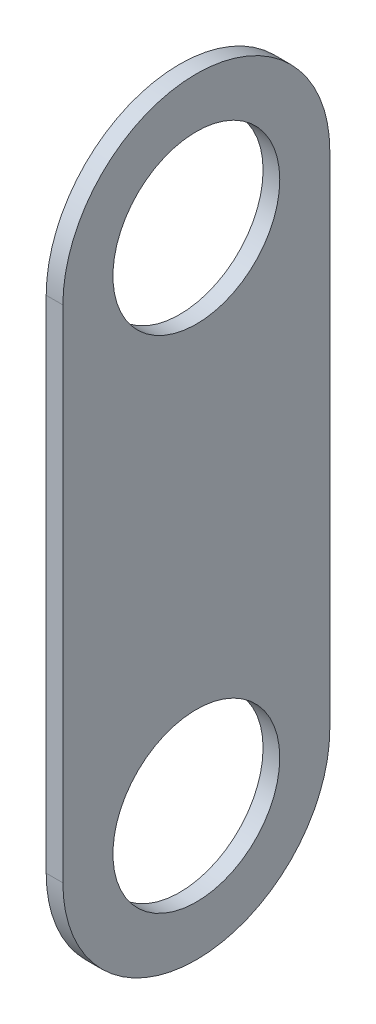
ISO-10303-21;
HEADER;
FILE_DESCRIPTION(('STEP AP214'),'2;1');
FILE_NAME('part.step','',(''),(''),'','','');
FILE_SCHEMA(('AUTOMOTIVE_DESIGN { 1 0 10303 214 1 1 1 1 }'));
ENDSEC;
DATA;
#1=APPLICATION_CONTEXT('core data for automotive mechanical design processes');
#2=APPLICATION_PROTOCOL_DEFINITION('international standard','automotive_design',2000,#1);
#3=PRODUCT_CONTEXT('',#1,'mechanical');
#4=PRODUCT('Part','Part','',(#3));
#5=PRODUCT_RELATED_PRODUCT_CATEGORY('part','',(#4));
#6=PRODUCT_DEFINITION_FORMATION('','',#4);
#7=PRODUCT_DEFINITION_CONTEXT('part definition',#1,'design');
#8=PRODUCT_DEFINITION('design','',#6,#7);
#9=PRODUCT_DEFINITION_SHAPE('','',#8);
#10=(LENGTH_UNIT() NAMED_UNIT(*) SI_UNIT(.MILLI.,.METRE.));
#11=(NAMED_UNIT(*) PLANE_ANGLE_UNIT() SI_UNIT($,.RADIAN.));
#12=(NAMED_UNIT(*) SI_UNIT($,.STERADIAN.) SOLID_ANGLE_UNIT());
#13=UNCERTAINTY_MEASURE_WITH_UNIT(LENGTH_MEASURE(1.E-05),#10,'distance_accuracy_value','');
#14=(GEOMETRIC_REPRESENTATION_CONTEXT(3) GLOBAL_UNCERTAINTY_ASSIGNED_CONTEXT((#13)) GLOBAL_UNIT_ASSIGNED_CONTEXT((#10,
#11,#12)) REPRESENTATION_CONTEXT('',''));
#15=CARTESIAN_POINT('',(0.,0.,0.));
#16=DIRECTION('',(0.,0.,1.));
#17=DIRECTION('',(1.,0.,0.));
#18=AXIS2_PLACEMENT_3D('',#15,#16,#17);
#19=CARTESIAN_POINT('',(-0.5,-7.5,0.));
#20=DIRECTION('',(1.,0.,0.));
#21=DIRECTION('',(0.,0.,-1.));
#22=AXIS2_PLACEMENT_3D('',#19,#20,#21);
#23=CYLINDRICAL_SURFACE('',#22,4.);
#24=CARTESIAN_POINT('',(0.,-7.5,0.));
#25=DIRECTION('',(1.,0.,0.));
#26=DIRECTION('',(0.,0.,-1.));
#27=AXIS2_PLACEMENT_3D('',#24,#25,#26);
#28=CIRCLE('',#27,4.);
#29=CARTESIAN_POINT('',(0.,-7.5,4.));
#30=VERTEX_POINT('',#29);
#31=CARTESIAN_POINT('',(0.,-7.5,-4.));
#32=VERTEX_POINT('',#31);
#33=EDGE_CURVE('E102',#30,#32,#28,.T.);
#34=ORIENTED_EDGE('',*,*,#33,.F.);
#35=DIRECTION('',(1.,0.,0.));
#36=VECTOR('',#35,1.);
#37=CARTESIAN_POINT('',(-0.5,-7.5,4.));
#38=LINE('',#37,#36);
#39=CARTESIAN_POINT('',(-0.5,-7.5,4.));
#40=VERTEX_POINT('',#39);
#41=EDGE_CURVE('E11',#40,#30,#38,.T.);
#42=ORIENTED_EDGE('',*,*,#41,.F.);
#43=CARTESIAN_POINT('',(-0.5,-7.5,0.));
#44=DIRECTION('',(1.,0.,0.));
#45=DIRECTION('',(0.,0.,-1.));
#46=AXIS2_PLACEMENT_3D('',#43,#44,#45);
#47=CIRCLE('',#46,4.);
#48=CARTESIAN_POINT('',(-0.5,-7.5,-4.));
#49=VERTEX_POINT('',#48);
#50=EDGE_CURVE('E95',#40,#49,#47,.T.);
#51=ORIENTED_EDGE('',*,*,#50,.T.);
#52=DIRECTION('',(1.,0.,0.));
#53=VECTOR('',#52,1.);
#54=CARTESIAN_POINT('',(-0.5,-7.5,-4.));
#55=LINE('',#54,#53);
#56=EDGE_CURVE('E40',#49,#32,#55,.T.);
#57=ORIENTED_EDGE('',*,*,#56,.T.);
#58=EDGE_LOOP('',(#34,#42,#51,#57));
#59=FACE_BOUND('',#58,.T.);
#60=ADVANCED_FACE('F37',(#59),#23,.T.);
#61=CARTESIAN_POINT('',(-0.5,-7.5,4.));
#62=DIRECTION('',(0.,0.,1.));
#63=DIRECTION('',(0.,-1.,0.));
#64=AXIS2_PLACEMENT_3D('',#61,#62,#63);
#65=PLANE('',#64);
#66=DIRECTION('',(0.,-1.,0.));
#67=VECTOR('',#66,1.);
#68=CARTESIAN_POINT('',(0.,-7.5,4.));
#69=LINE('',#68,#67);
#70=CARTESIAN_POINT('',(0.,7.5,4.00000000000001));
#71=VERTEX_POINT('',#70);
#72=EDGE_CURVE('E97',#71,#30,#69,.T.);
#73=ORIENTED_EDGE('',*,*,#72,.F.);
#74=DIRECTION('',(1.,0.,0.));
#75=VECTOR('',#74,1.);
#76=CARTESIAN_POINT('',(-0.5,7.5,4.00000000000001));
#77=LINE('',#76,#75);
#78=CARTESIAN_POINT('',(-0.5,7.5,4.00000000000001));
#79=VERTEX_POINT('',#78);
#80=EDGE_CURVE('E46',#79,#71,#77,.T.);
#81=ORIENTED_EDGE('',*,*,#80,.F.);
#82=DIRECTION('',(0.,-1.,0.));
#83=VECTOR('',#82,1.);
#84=CARTESIAN_POINT('',(-0.5,-7.5,4.));
#85=LINE('',#84,#83);
#86=EDGE_CURVE('E92',#79,#40,#85,.T.);
#87=ORIENTED_EDGE('',*,*,#86,.T.);
#88=ORIENTED_EDGE('',*,*,#41,.T.);
#89=EDGE_LOOP('',(#73,#81,#87,#88));
#90=FACE_BOUND('',#89,.T.);
#91=ADVANCED_FACE('F113',(#90),#65,.T.);
#92=CARTESIAN_POINT('',(-0.5,7.5,0.));
#93=DIRECTION('',(1.,0.,0.));
#94=DIRECTION('',(0.,0.,-1.));
#95=AXIS2_PLACEMENT_3D('',#92,#93,#94);
#96=CYLINDRICAL_SURFACE('',#95,4.);
#97=CARTESIAN_POINT('',(0.,7.5,0.));
#98=DIRECTION('',(1.,0.,0.));
#99=DIRECTION('',(0.,0.,-1.));
#100=AXIS2_PLACEMENT_3D('',#97,#98,#99);
#101=CIRCLE('',#100,4.);
#102=CARTESIAN_POINT('',(0.,7.5,-4.));
#103=VERTEX_POINT('',#102);
#104=EDGE_CURVE('E87',#103,#71,#101,.T.);
#105=ORIENTED_EDGE('',*,*,#104,.F.);
#106=DIRECTION('',(1.,0.,0.));
#107=VECTOR('',#106,1.);
#108=CARTESIAN_POINT('',(-0.5,7.5,-4.));
#109=LINE('',#108,#107);
#110=CARTESIAN_POINT('',(-0.5,7.5,-4.));
#111=VERTEX_POINT('',#110);
#112=EDGE_CURVE('E82',#111,#103,#109,.T.);
#113=ORIENTED_EDGE('',*,*,#112,.F.);
#114=CARTESIAN_POINT('',(-0.5,7.5,0.));
#115=DIRECTION('',(1.,0.,0.));
#116=DIRECTION('',(0.,0.,-1.));
#117=AXIS2_PLACEMENT_3D('',#114,#115,#116);
#118=CIRCLE('',#117,4.);
#119=EDGE_CURVE('E85',#111,#79,#118,.T.);
#120=ORIENTED_EDGE('',*,*,#119,.T.);
#121=ORIENTED_EDGE('',*,*,#80,.T.);
#122=EDGE_LOOP('',(#105,#113,#120,#121));
#123=FACE_BOUND('',#122,.T.);
#124=ADVANCED_FACE('F84',(#123),#96,.T.);
#125=CARTESIAN_POINT('',(-0.5,-7.5,-4.));
#126=DIRECTION('',(0.,0.,-1.));
#127=DIRECTION('',(0.,1.,0.));
#128=AXIS2_PLACEMENT_3D('',#125,#126,#127);
#129=PLANE('',#128);
#130=DIRECTION('',(0.,1.,0.));
#131=VECTOR('',#130,1.);
#132=CARTESIAN_POINT('',(0.,-7.5,-4.));
#133=LINE('',#132,#131);
#134=EDGE_CURVE('E105',#32,#103,#133,.T.);
#135=ORIENTED_EDGE('',*,*,#134,.F.);
#136=ORIENTED_EDGE('',*,*,#56,.F.);
#137=DIRECTION('',(0.,1.,0.));
#138=VECTOR('',#137,1.);
#139=CARTESIAN_POINT('',(-0.5,-7.5,-4.));
#140=LINE('',#139,#138);
#141=EDGE_CURVE('E91',#49,#111,#140,.T.);
#142=ORIENTED_EDGE('',*,*,#141,.T.);
#143=ORIENTED_EDGE('',*,*,#112,.T.);
#144=EDGE_LOOP('',(#135,#136,#142,#143));
#145=FACE_BOUND('',#144,.T.);
#146=ADVANCED_FACE('F94',(#145),#129,.T.);
#147=CARTESIAN_POINT('',(-0.5,-7.5,0.));
#148=DIRECTION('',(1.,0.,0.));
#149=DIRECTION('',(0.,0.,-1.));
#150=AXIS2_PLACEMENT_3D('',#147,#148,#149);
#151=PLANE('',#150);
#152=CARTESIAN_POINT('',(-0.5,-7.5,0.));
#153=DIRECTION('',(1.,0.,0.));
#154=DIRECTION('',(0.,0.,-1.));
#155=AXIS2_PLACEMENT_3D('',#152,#153,#154);
#156=CIRCLE('',#155,2.5);
#157=CARTESIAN_POINT('',(-0.5,-7.5,-2.5));
#158=VERTEX_POINT('',#157);
#159=EDGE_CURVE('E146',#158,#158,#156,.T.);
#160=ORIENTED_EDGE('',*,*,#159,.T.);
#161=EDGE_LOOP('',(#160));
#162=FACE_BOUND('',#161,.T.);
#163=CARTESIAN_POINT('',(-0.5,7.5,0.));
#164=DIRECTION('',(1.,0.,0.));
#165=DIRECTION('',(0.,0.,-1.));
#166=AXIS2_PLACEMENT_3D('',#163,#164,#165);
#167=CIRCLE('',#166,2.5);
#168=CARTESIAN_POINT('',(-0.5,7.5,-2.5));
#169=VERTEX_POINT('',#168);
#170=EDGE_CURVE('E106',#169,#169,#167,.T.);
#171=ORIENTED_EDGE('',*,*,#170,.T.);
#172=EDGE_LOOP('',(#171));
#173=FACE_BOUND('',#172,.T.);
#174=ORIENTED_EDGE('',*,*,#50,.F.);
#175=ORIENTED_EDGE('',*,*,#86,.F.);
#176=ORIENTED_EDGE('',*,*,#119,.F.);
#177=ORIENTED_EDGE('',*,*,#141,.F.);
#178=EDGE_LOOP('',(#174,#175,#176,#177));
#179=FACE_BOUND('',#178,.T.);
#180=ADVANCED_FACE('F90',(#162,#173,#179),#151,.F.);
#181=CARTESIAN_POINT('',(0.,-7.5,0.));
#182=DIRECTION('',(1.,0.,0.));
#183=DIRECTION('',(0.,0.,-1.));
#184=AXIS2_PLACEMENT_3D('',#181,#182,#183);
#185=PLANE('',#184);
#186=CARTESIAN_POINT('',(0.,-7.5,0.));
#187=DIRECTION('',(1.,0.,0.));
#188=DIRECTION('',(0.,0.,-1.));
#189=AXIS2_PLACEMENT_3D('',#186,#187,#188);
#190=CIRCLE('',#189,2.5);
#191=CARTESIAN_POINT('',(0.,-7.5,-2.5));
#192=VERTEX_POINT('',#191);
#193=EDGE_CURVE('E149',#192,#192,#190,.T.);
#194=ORIENTED_EDGE('',*,*,#193,.F.);
#195=EDGE_LOOP('',(#194));
#196=FACE_BOUND('',#195,.T.);
#197=CARTESIAN_POINT('',(0.,7.5,0.));
#198=DIRECTION('',(1.,0.,0.));
#199=DIRECTION('',(0.,0.,-1.));
#200=AXIS2_PLACEMENT_3D('',#197,#198,#199);
#201=CIRCLE('',#200,2.5);
#202=CARTESIAN_POINT('',(0.,7.5,-2.5));
#203=VERTEX_POINT('',#202);
#204=EDGE_CURVE('E151',#203,#203,#201,.T.);
#205=ORIENTED_EDGE('',*,*,#204,.F.);
#206=EDGE_LOOP('',(#205));
#207=FACE_BOUND('',#206,.T.);
#208=ORIENTED_EDGE('',*,*,#33,.T.);
#209=ORIENTED_EDGE('',*,*,#134,.T.);
#210=ORIENTED_EDGE('',*,*,#104,.T.);
#211=ORIENTED_EDGE('',*,*,#72,.T.);
#212=EDGE_LOOP('',(#208,#209,#210,#211));
#213=FACE_BOUND('',#212,.T.);
#214=ADVANCED_FACE('F112',(#196,#207,#213),#185,.T.);
#215=CARTESIAN_POINT('',(-0.5,7.5,0.));
#216=DIRECTION('',(1.,0.,0.));
#217=DIRECTION('',(0.,0.,-1.));
#218=AXIS2_PLACEMENT_3D('',#215,#216,#217);
#219=CYLINDRICAL_SURFACE('',#218,2.5);
#220=ORIENTED_EDGE('',*,*,#170,.F.);
#221=EDGE_LOOP('',(#220));
#222=FACE_BOUND('',#221,.T.);
#223=ORIENTED_EDGE('',*,*,#204,.T.);
#224=EDGE_LOOP('',(#223));
#225=FACE_BOUND('',#224,.T.);
#226=ADVANCED_FACE('F131',(#222,#225),#219,.F.);
#227=CARTESIAN_POINT('',(-0.5,-7.5,0.));
#228=DIRECTION('',(1.,0.,0.));
#229=DIRECTION('',(0.,0.,-1.));
#230=AXIS2_PLACEMENT_3D('',#227,#228,#229);
#231=CYLINDRICAL_SURFACE('',#230,2.5);
#232=ORIENTED_EDGE('',*,*,#159,.F.);
#233=EDGE_LOOP('',(#232));
#234=FACE_BOUND('',#233,.T.);
#235=ORIENTED_EDGE('',*,*,#193,.T.);
#236=EDGE_LOOP('',(#235));
#237=FACE_BOUND('',#236,.T.);
#238=ADVANCED_FACE('F138',(#234,#237),#231,.F.);
#239=CLOSED_SHELL('',(#60,#91,#124,#146,#180,#214,#226,#238));
#240=MANIFOLD_SOLID_BREP('B2',#239);
#241=ADVANCED_BREP_SHAPE_REPRESENTATION('',(#18,#240),#14);
#242=SHAPE_DEFINITION_REPRESENTATION(#9,#241);
ENDSEC;
END-ISO-10303-21;
